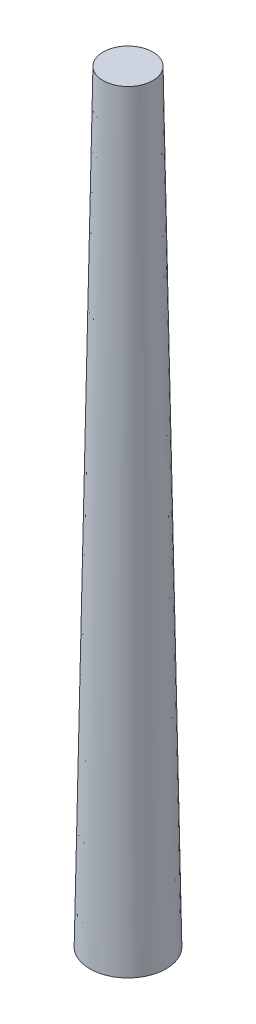
ISO-10303-21;
HEADER;
FILE_DESCRIPTION(('STEP AP214'),'2;1');
FILE_NAME('part.step','',(''),(''),'','','');
FILE_SCHEMA(('AUTOMOTIVE_DESIGN { 1 0 10303 214 1 1 1 1 }'));
ENDSEC;
DATA;
#1=APPLICATION_CONTEXT('core data for automotive mechanical design processes');
#2=APPLICATION_PROTOCOL_DEFINITION('international standard','automotive_design',2000,#1);
#3=PRODUCT_CONTEXT('',#1,'mechanical');
#4=PRODUCT('Part','Part','',(#3));
#5=PRODUCT_RELATED_PRODUCT_CATEGORY('part','',(#4));
#6=PRODUCT_DEFINITION_FORMATION('','',#4);
#7=PRODUCT_DEFINITION_CONTEXT('part definition',#1,'design');
#8=PRODUCT_DEFINITION('design','',#6,#7);
#9=PRODUCT_DEFINITION_SHAPE('','',#8);
#10=(LENGTH_UNIT() NAMED_UNIT(*) SI_UNIT(.MILLI.,.METRE.));
#11=(NAMED_UNIT(*) PLANE_ANGLE_UNIT() SI_UNIT($,.RADIAN.));
#12=(NAMED_UNIT(*) SI_UNIT($,.STERADIAN.) SOLID_ANGLE_UNIT());
#13=UNCERTAINTY_MEASURE_WITH_UNIT(LENGTH_MEASURE(1.E-05),#10,'distance_accuracy_value','');
#14=(GEOMETRIC_REPRESENTATION_CONTEXT(3) GLOBAL_UNCERTAINTY_ASSIGNED_CONTEXT((#13)) GLOBAL_UNIT_ASSIGNED_CONTEXT((#10,
#11,#12)) REPRESENTATION_CONTEXT('',''));
#15=CARTESIAN_POINT('',(0.,0.,0.));
#16=DIRECTION('',(0.,0.,1.));
#17=DIRECTION('',(1.,0.,0.));
#18=AXIS2_PLACEMENT_3D('',#15,#16,#17);
#19=CARTESIAN_POINT('',(0.,0.,0.));
#20=DIRECTION('',(0.,-1.,0.));
#21=DIRECTION('',(0.,0.,1.));
#22=AXIS2_PLACEMENT_3D('',#19,#20,#21);
#23=CONICAL_SURFACE('',#22,5.,0.0174532925199433);
#24=CARTESIAN_POINT('',(0.,100.,0.));
#25=DIRECTION('',(0.,1.,0.));
#26=DIRECTION('',(0.,0.,1.));
#27=AXIS2_PLACEMENT_3D('',#24,#25,#26);
#28=CIRCLE('',#27,3.25449350717824);
#29=CARTESIAN_POINT('',(0.,100.,3.25449350717824));
#30=VERTEX_POINT('',#29);
#31=EDGE_CURVE('E10',#30,#30,#28,.T.);
#32=ORIENTED_EDGE('',*,*,#31,.F.);
#33=EDGE_LOOP('',(#32));
#34=FACE_BOUND('',#33,.T.);
#35=CARTESIAN_POINT('',(0.,0.,0.));
#36=DIRECTION('',(0.,1.,0.));
#37=DIRECTION('',(0.,0.,1.));
#38=AXIS2_PLACEMENT_3D('',#35,#36,#37);
#39=CIRCLE('',#38,5.);
#40=CARTESIAN_POINT('',(0.,0.,5.));
#41=VERTEX_POINT('',#40);
#42=EDGE_CURVE('E39',#41,#41,#39,.T.);
#43=ORIENTED_EDGE('',*,*,#42,.T.);
#44=EDGE_LOOP('',(#43));
#45=FACE_BOUND('',#44,.T.);
#46=ADVANCED_FACE('F33',(#34,#45),#23,.T.);
#47=CARTESIAN_POINT('',(0.,100.,0.));
#48=DIRECTION('',(0.,1.,0.));
#49=DIRECTION('',(0.,0.,1.));
#50=AXIS2_PLACEMENT_3D('',#47,#48,#49);
#51=PLANE('',#50);
#52=ORIENTED_EDGE('',*,*,#31,.T.);
#53=EDGE_LOOP('',(#52));
#54=FACE_BOUND('',#53,.T.);
#55=ADVANCED_FACE('F48',(#54),#51,.T.);
#56=CARTESIAN_POINT('',(0.,0.,0.));
#57=DIRECTION('',(0.,1.,0.));
#58=DIRECTION('',(0.,0.,1.));
#59=AXIS2_PLACEMENT_3D('',#56,#57,#58);
#60=PLANE('',#59);
#61=ORIENTED_EDGE('',*,*,#42,.F.);
#62=EDGE_LOOP('',(#61));
#63=FACE_BOUND('',#62,.T.);
#64=ADVANCED_FACE('F46',(#63),#60,.F.);
#65=CLOSED_SHELL('',(#46,#55,#64));
#66=MANIFOLD_SOLID_BREP('B2',#65);
#67=ADVANCED_BREP_SHAPE_REPRESENTATION('',(#18,#66),#14);
#68=SHAPE_DEFINITION_REPRESENTATION(#9,#67);
ENDSEC;
END-ISO-10303-21;
